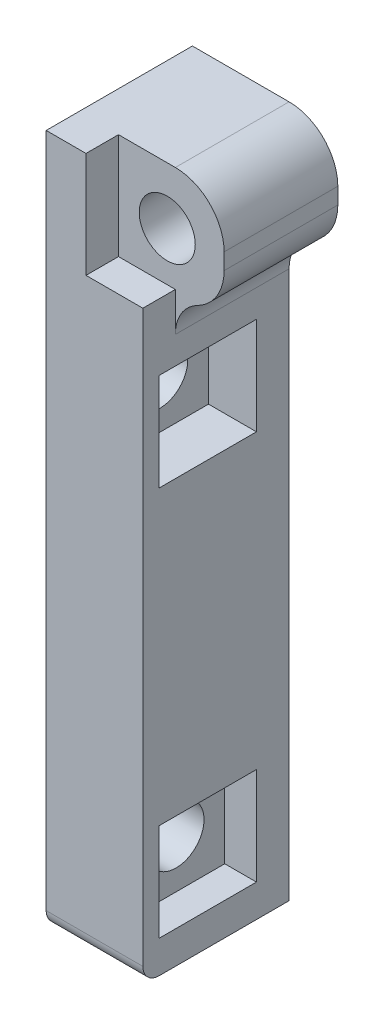
ISO-10303-21;
HEADER;
FILE_DESCRIPTION(('STEP AP214'),'2;1');
FILE_NAME('part.step','',(''),(''),'','','');
FILE_SCHEMA(('AUTOMOTIVE_DESIGN { 1 0 10303 214 1 1 1 1 }'));
ENDSEC;
DATA;
#1=APPLICATION_CONTEXT('core data for automotive mechanical design processes');
#2=APPLICATION_PROTOCOL_DEFINITION('international standard','automotive_design',2000,#1);
#3=PRODUCT_CONTEXT('',#1,'mechanical');
#4=PRODUCT('Part','Part','',(#3));
#5=PRODUCT_RELATED_PRODUCT_CATEGORY('part','',(#4));
#6=PRODUCT_DEFINITION_FORMATION('','',#4);
#7=PRODUCT_DEFINITION_CONTEXT('part definition',#1,'design');
#8=PRODUCT_DEFINITION('design','',#6,#7);
#9=PRODUCT_DEFINITION_SHAPE('','',#8);
#10=(LENGTH_UNIT() NAMED_UNIT(*) SI_UNIT(.MILLI.,.METRE.));
#11=(NAMED_UNIT(*) PLANE_ANGLE_UNIT() SI_UNIT($,.RADIAN.));
#12=(NAMED_UNIT(*) SI_UNIT($,.STERADIAN.) SOLID_ANGLE_UNIT());
#13=UNCERTAINTY_MEASURE_WITH_UNIT(LENGTH_MEASURE(1.E-05),#10,'distance_accuracy_value','');
#14=(GEOMETRIC_REPRESENTATION_CONTEXT(3) GLOBAL_UNCERTAINTY_ASSIGNED_CONTEXT((#13)) GLOBAL_UNIT_ASSIGNED_CONTEXT((#10,
#11,#12)) REPRESENTATION_CONTEXT('',''));
#15=CARTESIAN_POINT('',(0.,0.,0.));
#16=DIRECTION('',(0.,0.,1.));
#17=DIRECTION('',(1.,0.,0.));
#18=AXIS2_PLACEMENT_3D('',#15,#16,#17);
#19=CARTESIAN_POINT('',(-335.276056940968,-15.8857746361396,650.099929809571));
#20=DIRECTION('',(-1.,0.,0.));
#21=DIRECTION('',(0.,-0.707106781186568,0.707106781186527));
#22=AXIS2_PLACEMENT_3D('',#19,#20,#21);
#23=CYLINDRICAL_SURFACE('',#22,1.);
#24=CARTESIAN_POINT('',(-340.984336946103,-15.8857746361396,650.099929809571));
#25=DIRECTION('',(1.,0.,0.));
#26=DIRECTION('',(0.,-0.707106781186568,0.707106781186527));
#27=AXIS2_PLACEMENT_3D('',#24,#25,#26);
#28=CIRCLE('',#27,1.);
#29=CARTESIAN_POINT('',(-340.984336946103,-15.8857746361396,651.09992980957));
#30=VERTEX_POINT('',#29);
#31=CARTESIAN_POINT('',(-340.984336946103,-16.8857746361396,650.099929809571));
#32=VERTEX_POINT('',#31);
#33=EDGE_CURVE('E10',#30,#32,#28,.T.);
#34=ORIENTED_EDGE('',*,*,#33,.T.);
#35=DIRECTION('',(1.,0.,0.));
#36=VECTOR('',#35,1.);
#37=CARTESIAN_POINT('',(-335.276056940968,-16.8857746361396,650.099929809571));
#38=LINE('',#37,#36);
#39=CARTESIAN_POINT('',(-335.033329316708,-16.8857746361396,650.099929809571));
#40=VERTEX_POINT('',#39);
#41=EDGE_CURVE('E25',#32,#40,#38,.T.);
#42=ORIENTED_EDGE('',*,*,#41,.T.);
#43=CARTESIAN_POINT('',(-335.033329316708,-15.8857746361396,650.099929809571));
#44=DIRECTION('',(-1.,0.,0.));
#45=DIRECTION('',(0.,-0.707106781186568,0.707106781186527));
#46=AXIS2_PLACEMENT_3D('',#43,#44,#45);
#47=CIRCLE('',#46,1.);
#48=CARTESIAN_POINT('',(-335.033329316708,-15.8857746361396,651.09992980957));
#49=VERTEX_POINT('',#48);
#50=EDGE_CURVE('E462',#40,#49,#47,.T.);
#51=ORIENTED_EDGE('',*,*,#50,.T.);
#52=DIRECTION('',(-1.,0.,0.));
#53=VECTOR('',#52,1.);
#54=CARTESIAN_POINT('',(-335.276056940968,-15.8857746361396,651.09992980957));
#55=LINE('',#54,#53);
#56=EDGE_CURVE('E440',#49,#30,#55,.T.);
#57=ORIENTED_EDGE('',*,*,#56,.T.);
#58=EDGE_LOOP('',(#34,#42,#51,#57));
#59=FACE_BOUND('',#58,.T.);
#60=ADVANCED_FACE('F15',(#59),#23,.T.);
#61=CARTESIAN_POINT('',(-335.533116689554,22.199918793661,651.09992980957));
#62=DIRECTION('',(0.,0.,1.));
#63=DIRECTION('',(1.,0.,0.));
#64=AXIS2_PLACEMENT_3D('',#61,#62,#63);
#65=PLANE('',#64);
#66=ORIENTED_EDGE('',*,*,#56,.F.);
#67=DIRECTION('',(0.,-1.,0.));
#68=VECTOR('',#67,1.);
#69=CARTESIAN_POINT('',(-335.033329316708,6.65707184034212,651.09992980957));
#70=LINE('',#69,#68);
#71=CARTESIAN_POINT('',(-335.033329316708,19.199918793661,651.09992980957));
#72=VERTEX_POINT('',#71);
#73=EDGE_CURVE('E323',#72,#49,#70,.T.);
#74=ORIENTED_EDGE('',*,*,#73,.F.);
#75=DIRECTION('',(1.,0.,0.));
#76=VECTOR('',#75,1.);
#77=CARTESIAN_POINT('',(-335.533116689554,19.199918793661,651.09992980957));
#78=LINE('',#77,#76);
#79=CARTESIAN_POINT('',(-338.533116689554,19.199918793661,651.09992980957));
#80=VERTEX_POINT('',#79);
#81=EDGE_CURVE('E197',#80,#72,#78,.T.);
#82=ORIENTED_EDGE('',*,*,#81,.F.);
#83=DIRECTION('',(0.,-1.,0.));
#84=VECTOR('',#83,1.);
#85=CARTESIAN_POINT('',(-338.533116689554,22.199918793661,651.09992980957));
#86=LINE('',#85,#84);
#87=CARTESIAN_POINT('',(-338.533116689554,25.6999206542969,651.09992980957));
#88=VERTEX_POINT('',#87);
#89=EDGE_CURVE('E194',#88,#80,#86,.T.);
#90=ORIENTED_EDGE('',*,*,#89,.F.);
#91=DIRECTION('',(-1.,0.,0.));
#92=VECTOR('',#91,1.);
#93=CARTESIAN_POINT('',(-335.523649866994,25.6999206542969,651.09992980957));
#94=LINE('',#93,#92);
#95=CARTESIAN_POINT('',(-340.984336946103,25.6999206542969,651.09992980957));
#96=VERTEX_POINT('',#95);
#97=EDGE_CURVE('E433',#88,#96,#94,.T.);
#98=ORIENTED_EDGE('',*,*,#97,.T.);
#99=DIRECTION('',(0.,1.,0.));
#100=VECTOR('',#99,1.);
#101=CARTESIAN_POINT('',(-340.984336946103,22.199918793661,651.09992980957));
#102=LINE('',#101,#100);
#103=EDGE_CURVE('E203',#30,#96,#102,.T.);
#104=ORIENTED_EDGE('',*,*,#103,.F.);
#105=EDGE_LOOP('',(#66,#74,#82,#90,#98,#104));
#106=FACE_BOUND('',#105,.T.);
#107=ADVANCED_FACE('F222',(#106),#65,.T.);
#108=CARTESIAN_POINT('',(-335.033329316708,-8.88577511297678,647.108842063119));
#109=DIRECTION('',(-1.,0.,0.));
#110=DIRECTION('',(0.,0.,1.));
#111=AXIS2_PLACEMENT_3D('',#108,#109,#110);
#112=PLANE('',#111);
#113=ORIENTED_EDGE('',*,*,#50,.F.);
#114=DIRECTION('',(0.,0.,-1.));
#115=VECTOR('',#114,1.);
#116=CARTESIAN_POINT('',(-335.033329316708,-16.8857746361396,640.104370677556));
#117=LINE('',#116,#115);
#118=CARTESIAN_POINT('',(-335.033329316708,-16.8857746361396,642.09992980957));
#119=VERTEX_POINT('',#118);
#120=EDGE_CURVE('E441',#40,#119,#117,.T.);
#121=ORIENTED_EDGE('',*,*,#120,.T.);
#122=DIRECTION('',(0.,1.,0.));
#123=VECTOR('',#122,1.);
#124=CARTESIAN_POINT('',(-335.033329316708,6.65707184034211,642.09992980957));
#125=LINE('',#124,#123);
#126=CARTESIAN_POINT('',(-335.033329316708,16.8008376182799,642.09992980957));
#127=VERTEX_POINT('',#126);
#128=EDGE_CURVE('E445',#119,#127,#125,.T.);
#129=ORIENTED_EDGE('',*,*,#128,.T.);
#130=DIRECTION('',(0.,0.,1.));
#131=VECTOR('',#130,1.);
#132=CARTESIAN_POINT('',(-335.033329316708,16.8008376182799,644.604385936345));
#133=LINE('',#132,#131);
#134=CARTESIAN_POINT('',(-335.033329316708,16.8008376182799,649.09992980957));
#135=VERTEX_POINT('',#134);
#136=EDGE_CURVE('E322',#127,#135,#133,.T.);
#137=ORIENTED_EDGE('',*,*,#136,.T.);
#138=DIRECTION('',(0.,-1.,0.));
#139=VECTOR('',#138,1.);
#140=CARTESIAN_POINT('',(-335.033329316708,6.65707184034211,649.09992980957));
#141=LINE('',#140,#139);
#142=CARTESIAN_POINT('',(-335.033329316708,19.199918793661,649.09992980957));
#143=VERTEX_POINT('',#142);
#144=EDGE_CURVE('E326',#143,#135,#141,.T.);
#145=ORIENTED_EDGE('',*,*,#144,.F.);
#146=DIRECTION('',(0.,0.,1.));
#147=VECTOR('',#146,1.);
#148=CARTESIAN_POINT('',(-335.033329316708,19.199918793661,650.229370677555));
#149=LINE('',#148,#147);
#150=EDGE_CURVE('E315',#143,#72,#149,.T.);
#151=ORIENTED_EDGE('',*,*,#150,.T.);
#152=ORIENTED_EDGE('',*,*,#73,.T.);
#153=EDGE_LOOP('',(#113,#121,#129,#137,#145,#151,#152));
#154=FACE_BOUND('',#153,.T.);
#155=DIRECTION('',(0.,1.,0.));
#156=VECTOR('',#155,1.);
#157=CARTESIAN_POINT('',(-335.033329316708,-10.3857751129768,650.108842063119));
#158=LINE('',#157,#156);
#159=CARTESIAN_POINT('',(-335.033329316708,-14.8857751129768,650.108842063119));
#160=VERTEX_POINT('',#159);
#161=CARTESIAN_POINT('',(-335.033329316708,-8.88577511297678,650.108842063119));
#162=VERTEX_POINT('',#161);
#163=EDGE_CURVE('E450',#160,#162,#158,.T.);
#164=ORIENTED_EDGE('',*,*,#163,.T.);
#165=DIRECTION('',(0.,0.,-1.));
#166=VECTOR('',#165,1.);
#167=CARTESIAN_POINT('',(-335.033329316708,-8.88577511297678,647.108842063119));
#168=LINE('',#167,#166);
#169=CARTESIAN_POINT('',(-335.033329316708,-8.88577511297678,644.108842063119));
#170=VERTEX_POINT('',#169);
#171=EDGE_CURVE('E453',#162,#170,#168,.T.);
#172=ORIENTED_EDGE('',*,*,#171,.T.);
#173=DIRECTION('',(0.,-1.,0.));
#174=VECTOR('',#173,1.);
#175=CARTESIAN_POINT('',(-335.033329316708,-10.3857751129768,644.108842063119));
#176=LINE('',#175,#174);
#177=CARTESIAN_POINT('',(-335.033329316708,-14.8857751129768,644.108842063119));
#178=VERTEX_POINT('',#177);
#179=EDGE_CURVE('E162',#170,#178,#176,.T.);
#180=ORIENTED_EDGE('',*,*,#179,.T.);
#181=DIRECTION('',(0.,0.,1.));
#182=VECTOR('',#181,1.);
#183=CARTESIAN_POINT('',(-335.033329316708,-14.8857751129768,647.108842063119));
#184=LINE('',#183,#182);
#185=EDGE_CURVE('E406',#178,#160,#184,.T.);
#186=ORIENTED_EDGE('',*,*,#185,.T.);
#187=EDGE_LOOP('',(#164,#172,#180,#186));
#188=FACE_BOUND('',#187,.T.);
#189=DIRECTION('',(0.,1.,0.));
#190=VECTOR('',#189,1.);
#191=CARTESIAN_POINT('',(-335.033329316708,1.61422488702322,650.108842063119));
#192=LINE('',#191,#190);
#193=CARTESIAN_POINT('',(-335.033329316708,9.11422488702322,650.108842063119));
#194=VERTEX_POINT('',#193);
#195=CARTESIAN_POINT('',(-335.033329316708,15.1142248870232,650.108842063119));
#196=VERTEX_POINT('',#195);
#197=EDGE_CURVE('E401',#194,#196,#192,.T.);
#198=ORIENTED_EDGE('',*,*,#197,.T.);
#199=DIRECTION('',(0.,0.,-1.));
#200=VECTOR('',#199,1.);
#201=CARTESIAN_POINT('',(-335.033329316708,15.1142248870232,647.108842063119));
#202=LINE('',#201,#200);
#203=CARTESIAN_POINT('',(-335.033329316708,15.1142248870232,644.108842063119));
#204=VERTEX_POINT('',#203);
#205=EDGE_CURVE('E398',#196,#204,#202,.T.);
#206=ORIENTED_EDGE('',*,*,#205,.T.);
#207=DIRECTION('',(0.,-1.,0.));
#208=VECTOR('',#207,1.);
#209=CARTESIAN_POINT('',(-335.033329316708,1.61422488702321,644.108842063119));
#210=LINE('',#209,#208);
#211=CARTESIAN_POINT('',(-335.033329316708,9.11422488702321,644.108842063119));
#212=VERTEX_POINT('',#211);
#213=EDGE_CURVE('E396',#204,#212,#210,.T.);
#214=ORIENTED_EDGE('',*,*,#213,.T.);
#215=DIRECTION('',(0.,0.,1.));
#216=VECTOR('',#215,1.);
#217=CARTESIAN_POINT('',(-335.033329316708,9.11422488702321,647.108842063119));
#218=LINE('',#217,#216);
#219=EDGE_CURVE('E404',#212,#194,#218,.T.);
#220=ORIENTED_EDGE('',*,*,#219,.T.);
#221=EDGE_LOOP('',(#198,#206,#214,#220));
#222=FACE_BOUND('',#221,.T.);
#223=ADVANCED_FACE('F228',(#154,#188,#222),#112,.F.);
#224=CARTESIAN_POINT('',(-332.533329316708,16.8008376182799,644.604385936345));
#225=DIRECTION('',(0.,0.,-1.));
#226=DIRECTION('',(1.,0.,0.));
#227=AXIS2_PLACEMENT_3D('',#224,#225,#226);
#228=CYLINDRICAL_SURFACE('',#227,2.5);
#229=CARTESIAN_POINT('',(-332.533329316708,16.8008376182799,649.09992980957));
#230=DIRECTION('',(0.,0.,-1.));
#231=DIRECTION('',(1.,0.,0.));
#232=AXIS2_PLACEMENT_3D('',#229,#230,#231);
#233=CIRCLE('',#232,2.5);
#234=CARTESIAN_POINT('',(-333.669602098312,19.0276928371449,649.09992980957));
#235=VERTEX_POINT('',#234);
#236=EDGE_CURVE('E412',#135,#235,#233,.T.);
#237=ORIENTED_EDGE('',*,*,#236,.F.);
#238=ORIENTED_EDGE('',*,*,#136,.F.);
#239=CARTESIAN_POINT('',(-332.533329316708,16.8008376182799,642.09992980957));
#240=DIRECTION('',(0.,0.,-1.));
#241=DIRECTION('',(1.,0.,0.));
#242=AXIS2_PLACEMENT_3D('',#239,#240,#241);
#243=CIRCLE('',#242,2.5);
#244=CARTESIAN_POINT('',(-333.669602098312,19.0276928371449,642.09992980957));
#245=VERTEX_POINT('',#244);
#246=EDGE_CURVE('E408',#127,#245,#243,.T.);
#247=ORIENTED_EDGE('',*,*,#246,.T.);
#248=DIRECTION('',(0.,0.,-1.));
#249=VECTOR('',#248,1.);
#250=CARTESIAN_POINT('',(-333.669602098312,19.0276928371449,644.604385936345));
#251=LINE('',#250,#249);
#252=EDGE_CURVE('E417',#235,#245,#251,.T.);
#253=ORIENTED_EDGE('',*,*,#252,.F.);
#254=EDGE_LOOP('',(#237,#238,#247,#253));
#255=FACE_BOUND('',#254,.T.);
#256=ADVANCED_FACE('F234',(#255),#228,.F.);
#257=CARTESIAN_POINT('',(-335.033129436236,21.699919099783,644.604385936345));
#258=DIRECTION('',(0.,0.,-1.));
#259=DIRECTION('',(0.707106781186561,-0.707106781186534,0.));
#260=AXIS2_PLACEMENT_3D('',#257,#258,#259);
#261=CYLINDRICAL_SURFACE('',#260,3.);
#262=ORIENTED_EDGE('',*,*,#252,.T.);
#263=CARTESIAN_POINT('',(-335.033129436236,21.699919099783,642.09992980957));
#264=DIRECTION('',(0.,0.,-1.));
#265=DIRECTION('',(0.707106781186561,-0.707106781186534,0.));
#266=AXIS2_PLACEMENT_3D('',#263,#264,#265);
#267=CIRCLE('',#266,3.);
#268=CARTESIAN_POINT('',(-332.033129436236,21.699919099783,642.09992980957));
#269=VERTEX_POINT('',#268);
#270=EDGE_CURVE('E358',#269,#245,#267,.T.);
#271=ORIENTED_EDGE('',*,*,#270,.F.);
#272=DIRECTION('',(0.,0.,-1.));
#273=VECTOR('',#272,1.);
#274=CARTESIAN_POINT('',(-332.033129436236,21.699919099783,644.604385936345));
#275=LINE('',#274,#273);
#276=CARTESIAN_POINT('',(-332.033129436236,21.699919099783,649.09992980957));
#277=VERTEX_POINT('',#276);
#278=EDGE_CURVE('E370',#277,#269,#275,.T.);
#279=ORIENTED_EDGE('',*,*,#278,.F.);
#280=CARTESIAN_POINT('',(-335.033129436236,21.699919099783,649.09992980957));
#281=DIRECTION('',(0.,0.,1.));
#282=DIRECTION('',(0.707106781186561,-0.707106781186534,0.));
#283=AXIS2_PLACEMENT_3D('',#280,#281,#282);
#284=CIRCLE('',#283,3.);
#285=EDGE_CURVE('E414',#235,#277,#284,.T.);
#286=ORIENTED_EDGE('',*,*,#285,.F.);
#287=EDGE_LOOP('',(#262,#271,#279,#286));
#288=FACE_BOUND('',#287,.T.);
#289=ADVANCED_FACE('F238',(#288),#261,.T.);
#290=CARTESIAN_POINT('',(-335.533116689554,22.199918793661,649.09992980957));
#291=DIRECTION('',(0.,0.,-1.));
#292=DIRECTION('',(-1.,0.,0.));
#293=AXIS2_PLACEMENT_3D('',#290,#291,#292);
#294=PLANE('',#293);
#295=ORIENTED_EDGE('',*,*,#144,.T.);
#296=ORIENTED_EDGE('',*,*,#236,.T.);
#297=ORIENTED_EDGE('',*,*,#285,.T.);
#298=DIRECTION('',(0.,1.,0.));
#299=VECTOR('',#298,1.);
#300=CARTESIAN_POINT('',(-332.033129436236,22.199918793661,649.09992980957));
#301=LINE('',#300,#299);
#302=CARTESIAN_POINT('',(-332.033129436236,22.6999206542968,649.09992980957));
#303=VERTEX_POINT('',#302);
#304=EDGE_CURVE('E424',#277,#303,#301,.T.);
#305=ORIENTED_EDGE('',*,*,#304,.T.);
#306=CARTESIAN_POINT('',(-335.033129436236,22.6999206542968,649.09992980957));
#307=DIRECTION('',(0.,0.,1.));
#308=DIRECTION('',(0.707106781186559,0.707106781186536,0.));
#309=AXIS2_PLACEMENT_3D('',#306,#307,#308);
#310=CIRCLE('',#309,3.00000000000002);
#311=CARTESIAN_POINT('',(-335.033129436236,25.6999206542969,649.09992980957));
#312=VERTEX_POINT('',#311);
#313=EDGE_CURVE('E427',#303,#312,#310,.T.);
#314=ORIENTED_EDGE('',*,*,#313,.T.);
#315=DIRECTION('',(-1.,0.,0.));
#316=VECTOR('',#315,1.);
#317=CARTESIAN_POINT('',(-335.523649866994,25.6999206542969,649.09992980957));
#318=LINE('',#317,#316);
#319=CARTESIAN_POINT('',(-338.533116689554,25.6999206542969,649.099929809571));
#320=VERTEX_POINT('',#319);
#321=EDGE_CURVE('E332',#312,#320,#318,.T.);
#322=ORIENTED_EDGE('',*,*,#321,.T.);
#323=DIRECTION('',(0.,-1.,0.));
#324=VECTOR('',#323,1.);
#325=CARTESIAN_POINT('',(-338.533116689554,22.199918793661,649.099929809571));
#326=LINE('',#325,#324);
#327=CARTESIAN_POINT('',(-338.533116689554,19.199918793661,649.099929809571));
#328=VERTEX_POINT('',#327);
#329=EDGE_CURVE('E329',#320,#328,#326,.T.);
#330=ORIENTED_EDGE('',*,*,#329,.T.);
#331=DIRECTION('',(1.,0.,0.));
#332=VECTOR('',#331,1.);
#333=CARTESIAN_POINT('',(-335.533116689554,19.199918793661,649.09992980957));
#334=LINE('',#333,#332);
#335=EDGE_CURVE('E318',#328,#143,#334,.T.);
#336=ORIENTED_EDGE('',*,*,#335,.T.);
#337=EDGE_LOOP('',(#295,#296,#297,#305,#314,#322,#330,#336));
#338=FACE_BOUND('',#337,.T.);
#339=CARTESIAN_POINT('',(-335.533116689554,22.199918793661,649.09992980957));
#340=DIRECTION('',(0.,0.,1.));
#341=DIRECTION('',(1.,0.,0.));
#342=AXIS2_PLACEMENT_3D('',#339,#340,#341);
#343=CIRCLE('',#342,1.725);
#344=CARTESIAN_POINT('',(-333.808116689554,22.199918793661,649.09992980957));
#345=VERTEX_POINT('',#344);
#346=EDGE_CURVE('E189',#345,#345,#343,.T.);
#347=ORIENTED_EDGE('',*,*,#346,.F.);
#348=EDGE_LOOP('',(#347));
#349=FACE_BOUND('',#348,.T.);
#350=ADVANCED_FACE('F242',(#338,#349),#294,.F.);
#351=CARTESIAN_POINT('',(-328.03311920166,9.11422488702321,647.108842063119));
#352=DIRECTION('',(0.,-1.,0.));
#353=DIRECTION('',(-1.,0.,0.));
#354=AXIS2_PLACEMENT_3D('',#351,#352,#353);
#355=PLANE('',#354);
#356=ORIENTED_EDGE('',*,*,#219,.F.);
#357=DIRECTION('',(1.,0.,0.));
#358=VECTOR('',#357,1.);
#359=CARTESIAN_POINT('',(-328.03311920166,9.11422488702321,644.108842063119));
#360=LINE('',#359,#358);
#361=CARTESIAN_POINT('',(-337.984137065631,9.11422488702321,644.108842063119));
#362=VERTEX_POINT('',#361);
#363=EDGE_CURVE('E341',#362,#212,#360,.T.);
#364=ORIENTED_EDGE('',*,*,#363,.F.);
#365=DIRECTION('',(0.,0.,-1.));
#366=VECTOR('',#365,1.);
#367=CARTESIAN_POINT('',(-337.984137065631,9.11422488702321,647.108842063119));
#368=LINE('',#367,#366);
#369=CARTESIAN_POINT('',(-337.984137065631,9.11422488702322,650.108842063119));
#370=VERTEX_POINT('',#369);
#371=EDGE_CURVE('E344',#370,#362,#368,.T.);
#372=ORIENTED_EDGE('',*,*,#371,.F.);
#373=DIRECTION('',(1.,0.,0.));
#374=VECTOR('',#373,1.);
#375=CARTESIAN_POINT('',(-328.03311920166,9.11422488702322,650.108842063119));
#376=LINE('',#375,#374);
#377=EDGE_CURVE('E330',#370,#194,#376,.T.);
#378=ORIENTED_EDGE('',*,*,#377,.T.);
#379=EDGE_LOOP('',(#356,#364,#372,#378));
#380=FACE_BOUND('',#379,.T.);
#381=ADVANCED_FACE('F246',(#380),#355,.F.);
#382=CARTESIAN_POINT('',(-328.03311920166,12.1142248870232,650.108842063119));
#383=DIRECTION('',(0.,0.,1.));
#384=DIRECTION('',(1.,0.,0.));
#385=AXIS2_PLACEMENT_3D('',#382,#383,#384);
#386=PLANE('',#385);
#387=ORIENTED_EDGE('',*,*,#197,.F.);
#388=ORIENTED_EDGE('',*,*,#377,.F.);
#389=DIRECTION('',(0.,-1.,0.));
#390=VECTOR('',#389,1.);
#391=CARTESIAN_POINT('',(-337.984137065631,12.1142248870232,650.108842063119));
#392=LINE('',#391,#390);
#393=CARTESIAN_POINT('',(-337.984137065631,15.1142248870232,650.108842063119));
#394=VERTEX_POINT('',#393);
#395=EDGE_CURVE('E347',#394,#370,#392,.T.);
#396=ORIENTED_EDGE('',*,*,#395,.F.);
#397=DIRECTION('',(1.,0.,0.));
#398=VECTOR('',#397,1.);
#399=CARTESIAN_POINT('',(-328.03311920166,15.1142248870232,650.108842063119));
#400=LINE('',#399,#398);
#401=EDGE_CURVE('E335',#394,#196,#400,.T.);
#402=ORIENTED_EDGE('',*,*,#401,.T.);
#403=EDGE_LOOP('',(#387,#388,#396,#402));
#404=FACE_BOUND('',#403,.T.);
#405=ADVANCED_FACE('F250',(#404),#386,.F.);
#406=CARTESIAN_POINT('',(-327.03311920166,-14.8857751129768,647.108842063119));
#407=DIRECTION('',(0.,-1.,0.));
#408=DIRECTION('',(1.,0.,0.));
#409=AXIS2_PLACEMENT_3D('',#406,#407,#408);
#410=PLANE('',#409);
#411=ORIENTED_EDGE('',*,*,#185,.F.);
#412=DIRECTION('',(-1.,0.,0.));
#413=VECTOR('',#412,1.);
#414=CARTESIAN_POINT('',(-327.03311920166,-14.8857751129768,644.108842063119));
#415=LINE('',#414,#413);
#416=CARTESIAN_POINT('',(-336.984137065631,-14.8857751129768,644.108842063119));
#417=VERTEX_POINT('',#416);
#418=EDGE_CURVE('E353',#178,#417,#415,.T.);
#419=ORIENTED_EDGE('',*,*,#418,.T.);
#420=DIRECTION('',(0.,0.,-1.));
#421=VECTOR('',#420,1.);
#422=CARTESIAN_POINT('',(-336.984137065631,-14.8857751129768,647.108842063119));
#423=LINE('',#422,#421);
#424=CARTESIAN_POINT('',(-336.984137065631,-14.8857751129768,650.108842063119));
#425=VERTEX_POINT('',#424);
#426=EDGE_CURVE('E177',#425,#417,#423,.T.);
#427=ORIENTED_EDGE('',*,*,#426,.F.);
#428=DIRECTION('',(-1.,0.,0.));
#429=VECTOR('',#428,1.);
#430=CARTESIAN_POINT('',(-327.03311920166,-14.8857751129768,650.108842063119));
#431=LINE('',#430,#429);
#432=EDGE_CURVE('E354',#160,#425,#431,.T.);
#433=ORIENTED_EDGE('',*,*,#432,.F.);
#434=EDGE_LOOP('',(#411,#419,#427,#433));
#435=FACE_BOUND('',#434,.T.);
#436=ADVANCED_FACE('F254',(#435),#410,.F.);
#437=CARTESIAN_POINT('',(-327.03311920166,-11.8857751129768,650.108842063119));
#438=DIRECTION('',(0.,0.,1.));
#439=DIRECTION('',(1.,0.,0.));
#440=AXIS2_PLACEMENT_3D('',#437,#438,#439);
#441=PLANE('',#440);
#442=ORIENTED_EDGE('',*,*,#163,.F.);
#443=ORIENTED_EDGE('',*,*,#432,.T.);
#444=DIRECTION('',(0.,-1.,0.));
#445=VECTOR('',#444,1.);
#446=CARTESIAN_POINT('',(-336.984137065631,-11.8857751129768,650.108842063119));
#447=LINE('',#446,#445);
#448=CARTESIAN_POINT('',(-336.984137065631,-8.88577511297678,650.108842063119));
#449=VERTEX_POINT('',#448);
#450=EDGE_CURVE('E180',#449,#425,#447,.T.);
#451=ORIENTED_EDGE('',*,*,#450,.F.);
#452=DIRECTION('',(-1.,0.,0.));
#453=VECTOR('',#452,1.);
#454=CARTESIAN_POINT('',(-327.03311920166,-8.88577511297678,650.108842063119));
#455=LINE('',#454,#453);
#456=EDGE_CURVE('E172',#162,#449,#455,.T.);
#457=ORIENTED_EDGE('',*,*,#456,.F.);
#458=EDGE_LOOP('',(#442,#443,#451,#457));
#459=FACE_BOUND('',#458,.T.);
#460=ADVANCED_FACE('F258',(#459),#441,.F.);
#461=CARTESIAN_POINT('',(-335.533116689554,22.199918793661,642.09992980957));
#462=DIRECTION('',(0.,0.,1.));
#463=DIRECTION('',(1.,0.,0.));
#464=AXIS2_PLACEMENT_3D('',#461,#462,#463);
#465=PLANE('',#464);
#466=ORIENTED_EDGE('',*,*,#270,.T.);
#467=ORIENTED_EDGE('',*,*,#246,.F.);
#468=ORIENTED_EDGE('',*,*,#128,.F.);
#469=DIRECTION('',(1.,0.,0.));
#470=VECTOR('',#469,1.);
#471=CARTESIAN_POINT('',(-335.276056940968,-16.8857746361396,642.09992980957));
#472=LINE('',#471,#470);
#473=CARTESIAN_POINT('',(-340.984336946103,-16.8857746361396,642.09992980957));
#474=VERTEX_POINT('',#473);
#475=EDGE_CURVE('E362',#474,#119,#472,.T.);
#476=ORIENTED_EDGE('',*,*,#475,.F.);
#477=DIRECTION('',(0.,-1.,0.));
#478=VECTOR('',#477,1.);
#479=CARTESIAN_POINT('',(-340.984336946103,22.199918793661,642.09992980957));
#480=LINE('',#479,#478);
#481=CARTESIAN_POINT('',(-340.984336946103,25.6999206542969,642.09992980957));
#482=VERTEX_POINT('',#481);
#483=EDGE_CURVE('E200',#482,#474,#480,.T.);
#484=ORIENTED_EDGE('',*,*,#483,.F.);
#485=DIRECTION('',(-1.,0.,0.));
#486=VECTOR('',#485,1.);
#487=CARTESIAN_POINT('',(-335.523649866994,25.6999206542969,642.099929809571));
#488=LINE('',#487,#486);
#489=CARTESIAN_POINT('',(-335.033129436236,25.6999206542969,642.09992980957));
#490=VERTEX_POINT('',#489);
#491=EDGE_CURVE('E185',#490,#482,#488,.T.);
#492=ORIENTED_EDGE('',*,*,#491,.F.);
#493=CARTESIAN_POINT('',(-335.033129436236,22.6999206542968,642.09992980957));
#494=DIRECTION('',(0.,0.,-1.));
#495=DIRECTION('',(0.707106781186559,0.707106781186536,0.));
#496=AXIS2_PLACEMENT_3D('',#493,#494,#495);
#497=CIRCLE('',#496,3.00000000000002);
#498=CARTESIAN_POINT('',(-332.033129436236,22.6999206542968,642.09992980957));
#499=VERTEX_POINT('',#498);
#500=EDGE_CURVE('E367',#490,#499,#497,.T.);
#501=ORIENTED_EDGE('',*,*,#500,.T.);
#502=DIRECTION('',(0.,1.,0.));
#503=VECTOR('',#502,1.);
#504=CARTESIAN_POINT('',(-332.033129436236,22.199918793661,642.09992980957));
#505=LINE('',#504,#503);
#506=EDGE_CURVE('E371',#269,#499,#505,.T.);
#507=ORIENTED_EDGE('',*,*,#506,.F.);
#508=EDGE_LOOP('',(#466,#467,#468,#476,#484,#492,#501,#507));
#509=FACE_BOUND('',#508,.T.);
#510=CARTESIAN_POINT('',(-335.533116689554,22.199918793661,642.09992980957));
#511=DIRECTION('',(0.,0.,-1.));
#512=DIRECTION('',(1.,0.,0.));
#513=AXIS2_PLACEMENT_3D('',#510,#511,#512);
#514=CIRCLE('',#513,1.725);
#515=CARTESIAN_POINT('',(-333.808116689554,22.199918793661,642.09992980957));
#516=VERTEX_POINT('',#515);
#517=EDGE_CURVE('E193',#516,#516,#514,.T.);
#518=ORIENTED_EDGE('',*,*,#517,.F.);
#519=EDGE_LOOP('',(#518));
#520=FACE_BOUND('',#519,.T.);
#521=ADVANCED_FACE('F262',(#509,#520),#465,.F.);
#522=CARTESIAN_POINT('',(-332.033129436236,22.199918793661,642.09992980957));
#523=DIRECTION('',(1.,0.,0.));
#524=DIRECTION('',(0.,0.,-1.));
#525=AXIS2_PLACEMENT_3D('',#522,#523,#524);
#526=PLANE('',#525);
#527=ORIENTED_EDGE('',*,*,#278,.T.);
#528=ORIENTED_EDGE('',*,*,#506,.T.);
#529=DIRECTION('',(0.,0.,1.));
#530=VECTOR('',#529,1.);
#531=CARTESIAN_POINT('',(-332.033129436236,22.6999206542968,643.454864501953));
#532=LINE('',#531,#530);
#533=EDGE_CURVE('E373',#499,#303,#532,.T.);
#534=ORIENTED_EDGE('',*,*,#533,.T.);
#535=ORIENTED_EDGE('',*,*,#304,.F.);
#536=EDGE_LOOP('',(#527,#528,#534,#535));
#537=FACE_BOUND('',#536,.T.);
#538=ADVANCED_FACE('F266',(#537),#526,.T.);
#539=CARTESIAN_POINT('',(-328.03311920166,15.1142248870232,647.108842063119));
#540=DIRECTION('',(0.,1.,0.));
#541=DIRECTION('',(1.,0.,0.));
#542=AXIS2_PLACEMENT_3D('',#539,#540,#541);
#543=PLANE('',#542);
#544=ORIENTED_EDGE('',*,*,#205,.F.);
#545=ORIENTED_EDGE('',*,*,#401,.F.);
#546=DIRECTION('',(0.,0.,1.));
#547=VECTOR('',#546,1.);
#548=CARTESIAN_POINT('',(-337.984137065631,15.1142248870232,647.108842063119));
#549=LINE('',#548,#547);
#550=CARTESIAN_POINT('',(-337.984137065631,15.1142248870232,644.108842063119));
#551=VERTEX_POINT('',#550);
#552=EDGE_CURVE('E149',#551,#394,#549,.T.);
#553=ORIENTED_EDGE('',*,*,#552,.F.);
#554=DIRECTION('',(1.,0.,0.));
#555=VECTOR('',#554,1.);
#556=CARTESIAN_POINT('',(-328.03311920166,15.1142248870232,644.108842063119));
#557=LINE('',#556,#555);
#558=EDGE_CURVE('E378',#551,#204,#557,.T.);
#559=ORIENTED_EDGE('',*,*,#558,.T.);
#560=EDGE_LOOP('',(#544,#545,#553,#559));
#561=FACE_BOUND('',#560,.T.);
#562=ADVANCED_FACE('F270',(#561),#543,.F.);
#563=CARTESIAN_POINT('',(-337.984137065631,12.1142248870232,647.108842063119));
#564=DIRECTION('',(1.,0.,0.));
#565=DIRECTION('',(0.,0.,-1.));
#566=AXIS2_PLACEMENT_3D('',#563,#564,#565);
#567=PLANE('',#566);
#568=CARTESIAN_POINT('',(-337.984137065631,12.1142248870232,647.108842063119));
#569=DIRECTION('',(-1.,0.,0.));
#570=DIRECTION('',(0.,0.,1.));
#571=AXIS2_PLACEMENT_3D('',#568,#569,#570);
#572=CIRCLE('',#571,1.725);
#573=CARTESIAN_POINT('',(-337.984137065631,12.1142248870232,648.833842063119));
#574=VERTEX_POINT('',#573);
#575=EDGE_CURVE('E382',#574,#574,#572,.T.);
#576=ORIENTED_EDGE('',*,*,#575,.T.);
#577=EDGE_LOOP('',(#576));
#578=FACE_BOUND('',#577,.T.);
#579=DIRECTION('',(0.,1.,0.));
#580=VECTOR('',#579,1.);
#581=CARTESIAN_POINT('',(-337.984137065631,12.1142248870232,644.108842063119));
#582=LINE('',#581,#580);
#583=EDGE_CURVE('E380',#362,#551,#582,.T.);
#584=ORIENTED_EDGE('',*,*,#583,.T.);
#585=ORIENTED_EDGE('',*,*,#552,.T.);
#586=ORIENTED_EDGE('',*,*,#395,.T.);
#587=ORIENTED_EDGE('',*,*,#371,.T.);
#588=EDGE_LOOP('',(#584,#585,#586,#587));
#589=FACE_BOUND('',#588,.T.);
#590=ADVANCED_FACE('F274',(#578,#589),#567,.T.);
#591=CARTESIAN_POINT('',(-328.03311920166,12.1142248870232,644.108842063119));
#592=DIRECTION('',(0.,0.,-1.));
#593=DIRECTION('',(-1.,0.,0.));
#594=AXIS2_PLACEMENT_3D('',#591,#592,#593);
#595=PLANE('',#594);
#596=ORIENTED_EDGE('',*,*,#213,.F.);
#597=ORIENTED_EDGE('',*,*,#558,.F.);
#598=ORIENTED_EDGE('',*,*,#583,.F.);
#599=ORIENTED_EDGE('',*,*,#363,.T.);
#600=EDGE_LOOP('',(#596,#597,#598,#599));
#601=FACE_BOUND('',#600,.T.);
#602=ADVANCED_FACE('F277',(#601),#595,.F.);
#603=CARTESIAN_POINT('',(-334.03311920166,-11.8857751129768,647.108842063119));
#604=DIRECTION('',(-1.,0.,0.));
#605=DIRECTION('',(0.,0.,1.));
#606=AXIS2_PLACEMENT_3D('',#603,#604,#605);
#607=CYLINDRICAL_SURFACE('',#606,1.725);
#608=CARTESIAN_POINT('',(-336.984137065631,-11.8857751129768,647.108842063119));
#609=DIRECTION('',(1.,0.,0.));
#610=DIRECTION('',(0.,0.,1.));
#611=AXIS2_PLACEMENT_3D('',#608,#609,#610);
#612=CIRCLE('',#611,1.725);
#613=CARTESIAN_POINT('',(-336.984137065631,-11.8857751129768,648.833842063119));
#614=VERTEX_POINT('',#613);
#615=EDGE_CURVE('E345',#614,#614,#612,.T.);
#616=ORIENTED_EDGE('',*,*,#615,.T.);
#617=EDGE_LOOP('',(#616));
#618=FACE_BOUND('',#617,.T.);
#619=CARTESIAN_POINT('',(-340.984336946103,-11.8857751129768,647.108842063119));
#620=DIRECTION('',(-1.,0.,0.));
#621=DIRECTION('',(0.,0.,1.));
#622=AXIS2_PLACEMENT_3D('',#619,#620,#621);
#623=CIRCLE('',#622,1.725);
#624=CARTESIAN_POINT('',(-340.984336946103,-11.8857751129768,648.833842063119));
#625=VERTEX_POINT('',#624);
#626=EDGE_CURVE('E361',#625,#625,#623,.T.);
#627=ORIENTED_EDGE('',*,*,#626,.T.);
#628=EDGE_LOOP('',(#627));
#629=FACE_BOUND('',#628,.T.);
#630=ADVANCED_FACE('F281',(#618,#629),#607,.F.);
#631=CARTESIAN_POINT('',(-327.03311920166,-8.88577511297678,647.108842063119));
#632=DIRECTION('',(0.,1.,0.));
#633=DIRECTION('',(-1.,0.,0.));
#634=AXIS2_PLACEMENT_3D('',#631,#632,#633);
#635=PLANE('',#634);
#636=ORIENTED_EDGE('',*,*,#171,.F.);
#637=ORIENTED_EDGE('',*,*,#456,.T.);
#638=DIRECTION('',(0.,0.,1.));
#639=VECTOR('',#638,1.);
#640=CARTESIAN_POINT('',(-336.984137065631,-8.88577511297678,647.108842063119));
#641=LINE('',#640,#639);
#642=CARTESIAN_POINT('',(-336.984137065631,-8.88577511297678,644.108842063119));
#643=VERTEX_POINT('',#642);
#644=EDGE_CURVE('E165',#643,#449,#641,.T.);
#645=ORIENTED_EDGE('',*,*,#644,.F.);
#646=DIRECTION('',(-1.,0.,0.));
#647=VECTOR('',#646,1.);
#648=CARTESIAN_POINT('',(-327.03311920166,-8.88577511297678,644.108842063119));
#649=LINE('',#648,#647);
#650=EDGE_CURVE('E155',#170,#643,#649,.T.);
#651=ORIENTED_EDGE('',*,*,#650,.F.);
#652=EDGE_LOOP('',(#636,#637,#645,#651));
#653=FACE_BOUND('',#652,.T.);
#654=ADVANCED_FACE('F170',(#653),#635,.F.);
#655=CARTESIAN_POINT('',(-336.984137065631,-11.8857751129768,647.108842063119));
#656=DIRECTION('',(-1.,0.,0.));
#657=DIRECTION('',(0.,0.,1.));
#658=AXIS2_PLACEMENT_3D('',#655,#656,#657);
#659=PLANE('',#658);
#660=ORIENTED_EDGE('',*,*,#615,.F.);
#661=EDGE_LOOP('',(#660));
#662=FACE_BOUND('',#661,.T.);
#663=ORIENTED_EDGE('',*,*,#450,.T.);
#664=ORIENTED_EDGE('',*,*,#426,.T.);
#665=DIRECTION('',(0.,1.,0.));
#666=VECTOR('',#665,1.);
#667=CARTESIAN_POINT('',(-336.984137065631,-11.8857751129768,644.108842063119));
#668=LINE('',#667,#666);
#669=EDGE_CURVE('E160',#417,#643,#668,.T.);
#670=ORIENTED_EDGE('',*,*,#669,.T.);
#671=ORIENTED_EDGE('',*,*,#644,.T.);
#672=EDGE_LOOP('',(#663,#664,#670,#671));
#673=FACE_BOUND('',#672,.T.);
#674=ADVANCED_FACE('F176',(#662,#673),#659,.F.);
#675=CARTESIAN_POINT('',(-327.03311920166,-11.8857751129768,644.108842063119));
#676=DIRECTION('',(0.,0.,-1.));
#677=DIRECTION('',(-1.,0.,0.));
#678=AXIS2_PLACEMENT_3D('',#675,#676,#677);
#679=PLANE('',#678);
#680=ORIENTED_EDGE('',*,*,#179,.F.);
#681=ORIENTED_EDGE('',*,*,#650,.T.);
#682=ORIENTED_EDGE('',*,*,#669,.F.);
#683=ORIENTED_EDGE('',*,*,#418,.F.);
#684=EDGE_LOOP('',(#680,#681,#682,#683));
#685=FACE_BOUND('',#684,.T.);
#686=ADVANCED_FACE('F157',(#685),#679,.F.);
#687=CARTESIAN_POINT('',(-335.033129436236,22.6999206542968,643.454864501953));
#688=DIRECTION('',(0.,0.,1.));
#689=DIRECTION('',(0.707106781186559,0.707106781186536,0.));
#690=AXIS2_PLACEMENT_3D('',#687,#688,#689);
#691=CYLINDRICAL_SURFACE('',#690,3.00000000000002);
#692=ORIENTED_EDGE('',*,*,#500,.F.);
#693=DIRECTION('',(0.,0.,-1.));
#694=VECTOR('',#693,1.);
#695=CARTESIAN_POINT('',(-335.033129436236,25.6999206542969,643.454864501953));
#696=LINE('',#695,#694);
#697=EDGE_CURVE('E166',#312,#490,#696,.T.);
#698=ORIENTED_EDGE('',*,*,#697,.F.);
#699=ORIENTED_EDGE('',*,*,#313,.F.);
#700=ORIENTED_EDGE('',*,*,#533,.F.);
#701=EDGE_LOOP('',(#692,#698,#699,#700));
#702=FACE_BOUND('',#701,.T.);
#703=ADVANCED_FACE('F293',(#702),#691,.T.);
#704=CARTESIAN_POINT('',(-335.514183044434,25.6999206542969,644.809799194336));
#705=DIRECTION('',(0.,-1.,0.));
#706=DIRECTION('',(1.,0.,0.));
#707=AXIS2_PLACEMENT_3D('',#704,#705,#706);
#708=PLANE('',#707);
#709=ORIENTED_EDGE('',*,*,#697,.T.);
#710=ORIENTED_EDGE('',*,*,#491,.T.);
#711=DIRECTION('',(0.,0.,1.));
#712=VECTOR('',#711,1.);
#713=CARTESIAN_POINT('',(-340.984336946103,25.6999206542969,643.454864501953));
#714=LINE('',#713,#712);
#715=EDGE_CURVE('E186',#482,#96,#714,.T.);
#716=ORIENTED_EDGE('',*,*,#715,.T.);
#717=ORIENTED_EDGE('',*,*,#97,.F.);
#718=DIRECTION('',(0.,0.,1.));
#719=VECTOR('',#718,1.);
#720=CARTESIAN_POINT('',(-338.533116689554,25.6999206542969,649.079849243164));
#721=LINE('',#720,#719);
#722=EDGE_CURVE('E190',#320,#88,#721,.T.);
#723=ORIENTED_EDGE('',*,*,#722,.F.);
#724=ORIENTED_EDGE('',*,*,#321,.F.);
#725=EDGE_LOOP('',(#709,#710,#716,#717,#723,#724));
#726=FACE_BOUND('',#725,.T.);
#727=ADVANCED_FACE('F296',(#726),#708,.F.);
#728=CARTESIAN_POINT('',(-335.533116689554,22.199918793661,649.349899291992));
#729=DIRECTION('',(0.,0.,-1.));
#730=DIRECTION('',(1.,0.,0.));
#731=AXIS2_PLACEMENT_3D('',#728,#729,#730);
#732=CYLINDRICAL_SURFACE('',#731,1.725);
#733=ORIENTED_EDGE('',*,*,#346,.T.);
#734=EDGE_LOOP('',(#733));
#735=FACE_BOUND('',#734,.T.);
#736=ORIENTED_EDGE('',*,*,#517,.T.);
#737=EDGE_LOOP('',(#736));
#738=FACE_BOUND('',#737,.T.);
#739=ADVANCED_FACE('F300',(#735,#738),#732,.F.);
#740=CARTESIAN_POINT('',(-338.533116689554,22.199918793661,653.349899291992));
#741=DIRECTION('',(-1.,0.,0.));
#742=DIRECTION('',(0.,0.,1.));
#743=AXIS2_PLACEMENT_3D('',#740,#741,#742);
#744=PLANE('',#743);
#745=ORIENTED_EDGE('',*,*,#722,.T.);
#746=ORIENTED_EDGE('',*,*,#89,.T.);
#747=DIRECTION('',(0.,0.,-1.));
#748=VECTOR('',#747,1.);
#749=CARTESIAN_POINT('',(-338.533116689554,19.199918793661,653.349899291992));
#750=LINE('',#749,#748);
#751=EDGE_CURVE('E195',#80,#328,#750,.T.);
#752=ORIENTED_EDGE('',*,*,#751,.T.);
#753=ORIENTED_EDGE('',*,*,#329,.F.);
#754=EDGE_LOOP('',(#745,#746,#752,#753));
#755=FACE_BOUND('',#754,.T.);
#756=ADVANCED_FACE('F304',(#755),#744,.F.);
#757=CARTESIAN_POINT('',(-335.533116689554,19.199918793661,653.349899291992));
#758=DIRECTION('',(0.,-1.,0.));
#759=DIRECTION('',(0.,0.,1.));
#760=AXIS2_PLACEMENT_3D('',#757,#758,#759);
#761=PLANE('',#760);
#762=ORIENTED_EDGE('',*,*,#150,.F.);
#763=ORIENTED_EDGE('',*,*,#335,.F.);
#764=ORIENTED_EDGE('',*,*,#751,.F.);
#765=ORIENTED_EDGE('',*,*,#81,.T.);
#766=EDGE_LOOP('',(#762,#763,#764,#765));
#767=FACE_BOUND('',#766,.T.);
#768=ADVANCED_FACE('F218',(#767),#761,.F.);
#769=CARTESIAN_POINT('',(-335.018997192383,-16.8857746361396,633.099899291992));
#770=DIRECTION('',(0.,-1.,0.));
#771=DIRECTION('',(0.,0.,-1.));
#772=AXIS2_PLACEMENT_3D('',#769,#770,#771);
#773=PLANE('',#772);
#774=ORIENTED_EDGE('',*,*,#41,.F.);
#775=DIRECTION('',(0.,0.,1.));
#776=VECTOR('',#775,1.);
#777=CARTESIAN_POINT('',(-340.984336946103,-16.8857746361396,637.599914550781));
#778=LINE('',#777,#776);
#779=EDGE_CURVE('E198',#474,#32,#778,.T.);
#780=ORIENTED_EDGE('',*,*,#779,.F.);
#781=ORIENTED_EDGE('',*,*,#475,.T.);
#782=ORIENTED_EDGE('',*,*,#120,.F.);
#783=EDGE_LOOP('',(#774,#780,#781,#782));
#784=FACE_BOUND('',#783,.T.);
#785=ADVANCED_FACE('F211',(#784),#773,.T.);
#786=CARTESIAN_POINT('',(-340.984336946103,22.199918793661,642.09992980957));
#787=DIRECTION('',(-1.,0.,0.));
#788=DIRECTION('',(0.,0.,1.));
#789=AXIS2_PLACEMENT_3D('',#786,#787,#788);
#790=PLANE('',#789);
#791=ORIENTED_EDGE('',*,*,#33,.F.);
#792=ORIENTED_EDGE('',*,*,#103,.T.);
#793=ORIENTED_EDGE('',*,*,#715,.F.);
#794=ORIENTED_EDGE('',*,*,#483,.T.);
#795=ORIENTED_EDGE('',*,*,#779,.T.);
#796=EDGE_LOOP('',(#791,#792,#793,#794,#795));
#797=FACE_BOUND('',#796,.T.);
#798=ORIENTED_EDGE('',*,*,#626,.F.);
#799=EDGE_LOOP('',(#798));
#800=FACE_BOUND('',#799,.T.);
#801=CARTESIAN_POINT('',(-340.984336946103,12.1142248870232,647.108842063119));
#802=DIRECTION('',(-1.,0.,0.));
#803=DIRECTION('',(0.,0.,1.));
#804=AXIS2_PLACEMENT_3D('',#801,#802,#803);
#805=CIRCLE('',#804,1.725);
#806=CARTESIAN_POINT('',(-340.984336946103,12.1142248870232,648.833842063119));
#807=VERTEX_POINT('',#806);
#808=EDGE_CURVE('E19',#807,#807,#805,.T.);
#809=ORIENTED_EDGE('',*,*,#808,.F.);
#810=EDGE_LOOP('',(#809));
#811=FACE_BOUND('',#810,.T.);
#812=ADVANCED_FACE('F209',(#797,#800,#811),#790,.T.);
#813=CARTESIAN_POINT('',(-334.03311920166,12.1142248870232,647.108842063119));
#814=DIRECTION('',(-1.,0.,0.));
#815=DIRECTION('',(0.,0.,1.));
#816=AXIS2_PLACEMENT_3D('',#813,#814,#815);
#817=CYLINDRICAL_SURFACE('',#816,1.725);
#818=ORIENTED_EDGE('',*,*,#575,.F.);
#819=EDGE_LOOP('',(#818));
#820=FACE_BOUND('',#819,.T.);
#821=ORIENTED_EDGE('',*,*,#808,.T.);
#822=EDGE_LOOP('',(#821));
#823=FACE_BOUND('',#822,.T.);
#824=ADVANCED_FACE('F17',(#820,#823),#817,.F.);
#825=CLOSED_SHELL('',(#60,#107,#223,#256,#289,#350,#381,#405,#436,#460,#521,#538,#562,#590,#602,
#630,#654,#674,#686,#703,#727,#739,#756,#768,#785,#812,#824));
#826=MANIFOLD_SOLID_BREP('B1',#825);
#827=ADVANCED_BREP_SHAPE_REPRESENTATION('',(#18,#826),#14);
#828=SHAPE_DEFINITION_REPRESENTATION(#9,#827);
ENDSEC;
END-ISO-10303-21;
